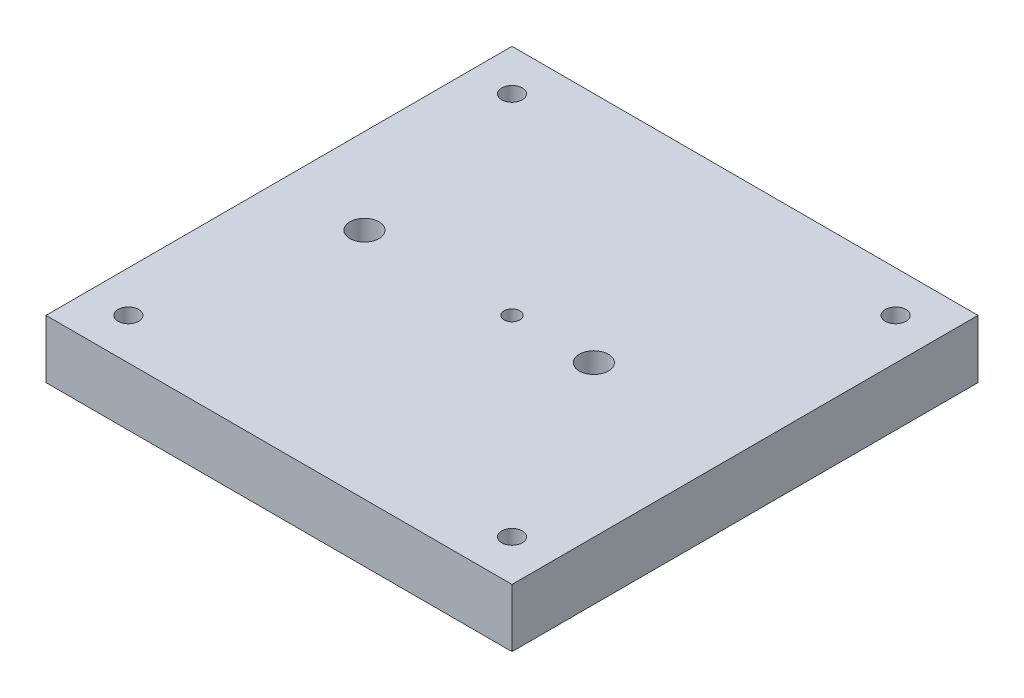
ISO-10303-21;
HEADER;
FILE_DESCRIPTION(('STEP AP214'),'2;1');
FILE_NAME('part.step','',(''),(''),'','','');
FILE_SCHEMA(('AUTOMOTIVE_DESIGN { 1 0 10303 214 1 1 1 1 }'));
ENDSEC;
DATA;
#1=APPLICATION_CONTEXT('core data for automotive mechanical design processes');
#2=APPLICATION_PROTOCOL_DEFINITION('international standard','automotive_design',2000,#1);
#3=PRODUCT_CONTEXT('',#1,'mechanical');
#4=PRODUCT('Part','Part','',(#3));
#5=PRODUCT_RELATED_PRODUCT_CATEGORY('part','',(#4));
#6=PRODUCT_DEFINITION_FORMATION('','',#4);
#7=PRODUCT_DEFINITION_CONTEXT('part definition',#1,'design');
#8=PRODUCT_DEFINITION('design','',#6,#7);
#9=PRODUCT_DEFINITION_SHAPE('','',#8);
#10=(LENGTH_UNIT() NAMED_UNIT(*) SI_UNIT(.MILLI.,.METRE.));
#11=(NAMED_UNIT(*) PLANE_ANGLE_UNIT() SI_UNIT($,.RADIAN.));
#12=(NAMED_UNIT(*) SI_UNIT($,.STERADIAN.) SOLID_ANGLE_UNIT());
#13=UNCERTAINTY_MEASURE_WITH_UNIT(LENGTH_MEASURE(1.E-05),#10,'distance_accuracy_value','');
#14=(GEOMETRIC_REPRESENTATION_CONTEXT(3) GLOBAL_UNCERTAINTY_ASSIGNED_CONTEXT((#13)) GLOBAL_UNIT_ASSIGNED_CONTEXT((#10,
#11,#12)) REPRESENTATION_CONTEXT('',''));
#15=CARTESIAN_POINT('',(0.,0.,0.));
#16=DIRECTION('',(0.,0.,1.));
#17=DIRECTION('',(1.,0.,0.));
#18=AXIS2_PLACEMENT_3D('',#15,#16,#17);
#19=CARTESIAN_POINT('',(50.8,-12.7,-50.8));
#20=DIRECTION('',(1.,0.,0.));
#21=DIRECTION('',(0.,0.,-1.));
#22=AXIS2_PLACEMENT_3D('',#19,#20,#21);
#23=PLANE('',#22);
#24=DIRECTION('',(0.,0.,-1.));
#25=VECTOR('',#24,1.);
#26=CARTESIAN_POINT('',(50.8,0.,-50.8));
#27=LINE('',#26,#25);
#28=CARTESIAN_POINT('',(50.8,0.,50.8));
#29=VERTEX_POINT('',#28);
#30=CARTESIAN_POINT('',(50.8,0.,-50.8));
#31=VERTEX_POINT('',#30);
#32=EDGE_CURVE('E119',#29,#31,#27,.T.);
#33=ORIENTED_EDGE('',*,*,#32,.F.);
#34=DIRECTION('',(0.,1.,0.));
#35=VECTOR('',#34,1.);
#36=CARTESIAN_POINT('',(50.8,-12.7,50.8));
#37=LINE('',#36,#35);
#38=CARTESIAN_POINT('',(50.8,-12.7,50.8));
#39=VERTEX_POINT('',#38);
#40=EDGE_CURVE('E12',#39,#29,#37,.T.);
#41=ORIENTED_EDGE('',*,*,#40,.F.);
#42=DIRECTION('',(0.,0.,-1.));
#43=VECTOR('',#42,1.);
#44=CARTESIAN_POINT('',(50.8,-12.7,-50.8));
#45=LINE('',#44,#43);
#46=CARTESIAN_POINT('',(50.8,-12.7,-50.8));
#47=VERTEX_POINT('',#46);
#48=EDGE_CURVE('E110',#39,#47,#45,.T.);
#49=ORIENTED_EDGE('',*,*,#48,.T.);
#50=DIRECTION('',(0.,1.,0.));
#51=VECTOR('',#50,1.);
#52=CARTESIAN_POINT('',(50.8,-12.7,-50.8));
#53=LINE('',#52,#51);
#54=EDGE_CURVE('E51',#47,#31,#53,.T.);
#55=ORIENTED_EDGE('',*,*,#54,.T.);
#56=EDGE_LOOP('',(#33,#41,#49,#55));
#57=FACE_BOUND('',#56,.T.);
#58=ADVANCED_FACE('F48',(#57),#23,.T.);
#59=CARTESIAN_POINT('',(-50.8,-12.7,50.8));
#60=DIRECTION('',(0.,0.,1.));
#61=DIRECTION('',(1.,0.,0.));
#62=AXIS2_PLACEMENT_3D('',#59,#60,#61);
#63=PLANE('',#62);
#64=DIRECTION('',(1.,0.,0.));
#65=VECTOR('',#64,1.);
#66=CARTESIAN_POINT('',(-50.8,0.,50.8));
#67=LINE('',#66,#65);
#68=CARTESIAN_POINT('',(-50.8,0.,50.8));
#69=VERTEX_POINT('',#68);
#70=EDGE_CURVE('E113',#69,#29,#67,.T.);
#71=ORIENTED_EDGE('',*,*,#70,.F.);
#72=DIRECTION('',(0.,1.,0.));
#73=VECTOR('',#72,1.);
#74=CARTESIAN_POINT('',(-50.8,-12.7,50.8));
#75=LINE('',#74,#73);
#76=CARTESIAN_POINT('',(-50.8,-12.7,50.8));
#77=VERTEX_POINT('',#76);
#78=EDGE_CURVE('E58',#77,#69,#75,.T.);
#79=ORIENTED_EDGE('',*,*,#78,.F.);
#80=DIRECTION('',(1.,0.,0.));
#81=VECTOR('',#80,1.);
#82=CARTESIAN_POINT('',(-50.8,-12.7,50.8));
#83=LINE('',#82,#81);
#84=EDGE_CURVE('E105',#77,#39,#83,.T.);
#85=ORIENTED_EDGE('',*,*,#84,.T.);
#86=ORIENTED_EDGE('',*,*,#40,.T.);
#87=EDGE_LOOP('',(#71,#79,#85,#86));
#88=FACE_BOUND('',#87,.T.);
#89=ADVANCED_FACE('F143',(#88),#63,.T.);
#90=CARTESIAN_POINT('',(-50.8,-12.7,-50.8));
#91=DIRECTION('',(-1.,0.,0.));
#92=DIRECTION('',(0.,0.,1.));
#93=AXIS2_PLACEMENT_3D('',#90,#91,#92);
#94=PLANE('',#93);
#95=DIRECTION('',(0.,0.,1.));
#96=VECTOR('',#95,1.);
#97=CARTESIAN_POINT('',(-50.8,0.,-50.8));
#98=LINE('',#97,#96);
#99=CARTESIAN_POINT('',(-50.8,0.,-50.8));
#100=VERTEX_POINT('',#99);
#101=EDGE_CURVE('E99',#100,#69,#98,.T.);
#102=ORIENTED_EDGE('',*,*,#101,.F.);
#103=DIRECTION('',(0.,1.,0.));
#104=VECTOR('',#103,1.);
#105=CARTESIAN_POINT('',(-50.8,-12.7,-50.8));
#106=LINE('',#105,#104);
#107=CARTESIAN_POINT('',(-50.8,-12.7,-50.8));
#108=VERTEX_POINT('',#107);
#109=EDGE_CURVE('E94',#108,#100,#106,.T.);
#110=ORIENTED_EDGE('',*,*,#109,.F.);
#111=DIRECTION('',(0.,0.,1.));
#112=VECTOR('',#111,1.);
#113=CARTESIAN_POINT('',(-50.8,-12.7,-50.8));
#114=LINE('',#113,#112);
#115=EDGE_CURVE('E97',#108,#77,#114,.T.);
#116=ORIENTED_EDGE('',*,*,#115,.T.);
#117=ORIENTED_EDGE('',*,*,#78,.T.);
#118=EDGE_LOOP('',(#102,#110,#116,#117));
#119=FACE_BOUND('',#118,.T.);
#120=ADVANCED_FACE('F96',(#119),#94,.T.);
#121=CARTESIAN_POINT('',(-50.8,-12.7,-50.8));
#122=DIRECTION('',(0.,0.,-1.));
#123=DIRECTION('',(-1.,0.,0.));
#124=AXIS2_PLACEMENT_3D('',#121,#122,#123);
#125=PLANE('',#124);
#126=DIRECTION('',(-1.,0.,0.));
#127=VECTOR('',#126,1.);
#128=CARTESIAN_POINT('',(-50.8,0.,-50.8));
#129=LINE('',#128,#127);
#130=EDGE_CURVE('E124',#31,#100,#129,.T.);
#131=ORIENTED_EDGE('',*,*,#130,.F.);
#132=ORIENTED_EDGE('',*,*,#54,.F.);
#133=DIRECTION('',(-1.,0.,0.));
#134=VECTOR('',#133,1.);
#135=CARTESIAN_POINT('',(-50.8,-12.7,-50.8));
#136=LINE('',#135,#134);
#137=EDGE_CURVE('E104',#47,#108,#136,.T.);
#138=ORIENTED_EDGE('',*,*,#137,.T.);
#139=ORIENTED_EDGE('',*,*,#109,.T.);
#140=EDGE_LOOP('',(#131,#132,#138,#139));
#141=FACE_BOUND('',#140,.T.);
#142=ADVANCED_FACE('F108',(#141),#125,.T.);
#143=CARTESIAN_POINT('',(0.,-12.7,0.));
#144=DIRECTION('',(0.,1.,0.));
#145=DIRECTION('',(0.,0.,1.));
#146=AXIS2_PLACEMENT_3D('',#143,#144,#145);
#147=PLANE('',#146);
#148=CARTESIAN_POINT('',(-41.8197438789284,-12.7,41.8197438789309));
#149=DIRECTION('',(0.,1.,0.));
#150=DIRECTION('',(0.,0.,1.));
#151=AXIS2_PLACEMENT_3D('',#148,#149,#150);
#152=CIRCLE('',#151,2.2479);
#153=CARTESIAN_POINT('',(-41.8197438789284,-12.7,44.0676438789309));
#154=VERTEX_POINT('',#153);
#155=EDGE_CURVE('E255',#154,#154,#152,.T.);
#156=ORIENTED_EDGE('',*,*,#155,.T.);
#157=EDGE_LOOP('',(#156));
#158=FACE_BOUND('',#157,.T.);
#159=CARTESIAN_POINT('',(41.8197438789333,-12.7,41.8197438789284));
#160=DIRECTION('',(0.,1.,0.));
#161=DIRECTION('',(0.,0.,1.));
#162=AXIS2_PLACEMENT_3D('',#159,#160,#161);
#163=CIRCLE('',#162,2.2479);
#164=CARTESIAN_POINT('',(41.8197438789333,-12.7,44.0676438789284));
#165=VERTEX_POINT('',#164);
#166=EDGE_CURVE('E247',#165,#165,#163,.T.);
#167=ORIENTED_EDGE('',*,*,#166,.T.);
#168=EDGE_LOOP('',(#167));
#169=FACE_BOUND('',#168,.T.);
#170=CARTESIAN_POINT('',(41.8197438789309,-12.7,-41.8197438789333));
#171=DIRECTION('',(0.,1.,0.));
#172=DIRECTION('',(0.,0.,1.));
#173=AXIS2_PLACEMENT_3D('',#170,#171,#172);
#174=CIRCLE('',#173,2.2479);
#175=CARTESIAN_POINT('',(41.8197438789309,-12.7,-39.5718438789333));
#176=VERTEX_POINT('',#175);
#177=EDGE_CURVE('E237',#176,#176,#174,.T.);
#178=ORIENTED_EDGE('',*,*,#177,.T.);
#179=EDGE_LOOP('',(#178));
#180=FACE_BOUND('',#179,.T.);
#181=CARTESIAN_POINT('',(0.,-12.7,0.));
#182=DIRECTION('',(0.,1.,0.));
#183=DIRECTION('',(0.,0.,1.));
#184=AXIS2_PLACEMENT_3D('',#181,#182,#183);
#185=CIRCLE('',#184,1.7272);
#186=CARTESIAN_POINT('',(0.,-12.7,1.72719999999999));
#187=VERTEX_POINT('',#186);
#188=EDGE_CURVE('E228',#187,#187,#185,.T.);
#189=ORIENTED_EDGE('',*,*,#188,.T.);
#190=EDGE_LOOP('',(#189));
#191=FACE_BOUND('',#190,.T.);
#192=CARTESIAN_POINT('',(-41.8197438789309,-12.7,-41.8197438789309));
#193=DIRECTION('',(0.,1.,0.));
#194=DIRECTION('',(0.,0.,1.));
#195=AXIS2_PLACEMENT_3D('',#192,#193,#194);
#196=CIRCLE('',#195,2.2479);
#197=CARTESIAN_POINT('',(-41.8197438789309,-12.7,-39.5718438789309));
#198=VERTEX_POINT('',#197);
#199=EDGE_CURVE('E220',#198,#198,#196,.T.);
#200=ORIENTED_EDGE('',*,*,#199,.T.);
#201=EDGE_LOOP('',(#200));
#202=FACE_BOUND('',#201,.T.);
#203=CARTESIAN_POINT('',(-32.16507791,-12.7,0.));
#204=DIRECTION('',(0.,1.,0.));
#205=DIRECTION('',(0.,0.,1.));
#206=AXIS2_PLACEMENT_3D('',#203,#204,#205);
#207=CIRCLE('',#206,3.175);
#208=CARTESIAN_POINT('',(-32.16507791,-12.7,3.17500000000001));
#209=VERTEX_POINT('',#208);
#210=EDGE_CURVE('E197',#209,#209,#207,.T.);
#211=ORIENTED_EDGE('',*,*,#210,.T.);
#212=EDGE_LOOP('',(#211));
#213=FACE_BOUND('',#212,.T.);
#214=CARTESIAN_POINT('',(17.8435508,-12.7,0.));
#215=DIRECTION('',(0.,1.,0.));
#216=DIRECTION('',(0.,0.,1.));
#217=AXIS2_PLACEMENT_3D('',#214,#215,#216);
#218=CIRCLE('',#217,3.175);
#219=CARTESIAN_POINT('',(17.8435508,-12.7,3.175));
#220=VERTEX_POINT('',#219);
#221=EDGE_CURVE('E125',#220,#220,#218,.T.);
#222=ORIENTED_EDGE('',*,*,#221,.T.);
#223=EDGE_LOOP('',(#222));
#224=FACE_BOUND('',#223,.T.);
#225=ORIENTED_EDGE('',*,*,#48,.F.);
#226=ORIENTED_EDGE('',*,*,#84,.F.);
#227=ORIENTED_EDGE('',*,*,#115,.F.);
#228=ORIENTED_EDGE('',*,*,#137,.F.);
#229=EDGE_LOOP('',(#225,#226,#227,#228));
#230=FACE_BOUND('',#229,.T.);
#231=ADVANCED_FACE('F103',(#158,#169,#180,#191,#202,#213,#224,#230),#147,.F.);
#232=CARTESIAN_POINT('',(0.,0.,0.));
#233=DIRECTION('',(0.,1.,0.));
#234=DIRECTION('',(0.,0.,1.));
#235=AXIS2_PLACEMENT_3D('',#232,#233,#234);
#236=PLANE('',#235);
#237=CARTESIAN_POINT('',(-41.8197438789284,0.,41.8197438789309));
#238=DIRECTION('',(0.,1.,0.));
#239=DIRECTION('',(0.,0.,1.));
#240=AXIS2_PLACEMENT_3D('',#237,#238,#239);
#241=CIRCLE('',#240,2.2479);
#242=CARTESIAN_POINT('',(-41.8197438789284,0.,44.0676438789309));
#243=VERTEX_POINT('',#242);
#244=EDGE_CURVE('E250',#243,#243,#241,.T.);
#245=ORIENTED_EDGE('',*,*,#244,.F.);
#246=EDGE_LOOP('',(#245));
#247=FACE_BOUND('',#246,.T.);
#248=CARTESIAN_POINT('',(41.8197438789333,0.,41.8197438789284));
#249=DIRECTION('',(0.,1.,0.));
#250=DIRECTION('',(0.,0.,1.));
#251=AXIS2_PLACEMENT_3D('',#248,#249,#250);
#252=CIRCLE('',#251,2.2479);
#253=CARTESIAN_POINT('',(41.8197438789333,0.,44.0676438789284));
#254=VERTEX_POINT('',#253);
#255=EDGE_CURVE('E242',#254,#254,#252,.T.);
#256=ORIENTED_EDGE('',*,*,#255,.F.);
#257=EDGE_LOOP('',(#256));
#258=FACE_BOUND('',#257,.T.);
#259=CARTESIAN_POINT('',(41.8197438789309,0.,-41.8197438789333));
#260=DIRECTION('',(0.,1.,0.));
#261=DIRECTION('',(0.,0.,1.));
#262=AXIS2_PLACEMENT_3D('',#259,#260,#261);
#263=CIRCLE('',#262,2.2479);
#264=CARTESIAN_POINT('',(41.8197438789309,0.,-39.5718438789333));
#265=VERTEX_POINT('',#264);
#266=EDGE_CURVE('E232',#265,#265,#263,.T.);
#267=ORIENTED_EDGE('',*,*,#266,.F.);
#268=EDGE_LOOP('',(#267));
#269=FACE_BOUND('',#268,.T.);
#270=CARTESIAN_POINT('',(0.,0.,0.));
#271=DIRECTION('',(0.,1.,0.));
#272=DIRECTION('',(0.,0.,1.));
#273=AXIS2_PLACEMENT_3D('',#270,#271,#272);
#274=CIRCLE('',#273,1.7272);
#275=CARTESIAN_POINT('',(0.,0.,1.72719999999999));
#276=VERTEX_POINT('',#275);
#277=EDGE_CURVE('E223',#276,#276,#274,.T.);
#278=ORIENTED_EDGE('',*,*,#277,.F.);
#279=EDGE_LOOP('',(#278));
#280=FACE_BOUND('',#279,.T.);
#281=CARTESIAN_POINT('',(-41.8197438789309,0.,-41.8197438789309));
#282=DIRECTION('',(0.,1.,0.));
#283=DIRECTION('',(0.,0.,1.));
#284=AXIS2_PLACEMENT_3D('',#281,#282,#283);
#285=CIRCLE('',#284,2.2479);
#286=CARTESIAN_POINT('',(-41.8197438789309,0.,-39.5718438789309));
#287=VERTEX_POINT('',#286);
#288=EDGE_CURVE('E208',#287,#287,#285,.T.);
#289=ORIENTED_EDGE('',*,*,#288,.F.);
#290=EDGE_LOOP('',(#289));
#291=FACE_BOUND('',#290,.T.);
#292=CARTESIAN_POINT('',(-32.16507791,0.,0.));
#293=DIRECTION('',(0.,1.,0.));
#294=DIRECTION('',(0.,0.,1.));
#295=AXIS2_PLACEMENT_3D('',#292,#293,#294);
#296=CIRCLE('',#295,3.175);
#297=CARTESIAN_POINT('',(-32.16507791,0.,3.17500000000001));
#298=VERTEX_POINT('',#297);
#299=EDGE_CURVE('E200',#298,#298,#296,.T.);
#300=ORIENTED_EDGE('',*,*,#299,.F.);
#301=EDGE_LOOP('',(#300));
#302=FACE_BOUND('',#301,.T.);
#303=CARTESIAN_POINT('',(17.8435508,0.,0.));
#304=DIRECTION('',(0.,1.,0.));
#305=DIRECTION('',(0.,0.,1.));
#306=AXIS2_PLACEMENT_3D('',#303,#304,#305);
#307=CIRCLE('',#306,3.175);
#308=CARTESIAN_POINT('',(17.8435508,0.,3.175));
#309=VERTEX_POINT('',#308);
#310=EDGE_CURVE('E203',#309,#309,#307,.T.);
#311=ORIENTED_EDGE('',*,*,#310,.F.);
#312=EDGE_LOOP('',(#311));
#313=FACE_BOUND('',#312,.T.);
#314=ORIENTED_EDGE('',*,*,#32,.T.);
#315=ORIENTED_EDGE('',*,*,#130,.T.);
#316=ORIENTED_EDGE('',*,*,#101,.T.);
#317=ORIENTED_EDGE('',*,*,#70,.T.);
#318=EDGE_LOOP('',(#314,#315,#316,#317));
#319=FACE_BOUND('',#318,.T.);
#320=ADVANCED_FACE('F142',(#247,#258,#269,#280,#291,#302,#313,#319),#236,.T.);
#321=CARTESIAN_POINT('',(17.8435508,-12.7,0.));
#322=DIRECTION('',(0.,1.,0.));
#323=DIRECTION('',(0.,0.,1.));
#324=AXIS2_PLACEMENT_3D('',#321,#322,#323);
#325=CYLINDRICAL_SURFACE('',#324,3.175);
#326=ORIENTED_EDGE('',*,*,#221,.F.);
#327=EDGE_LOOP('',(#326));
#328=FACE_BOUND('',#327,.T.);
#329=ORIENTED_EDGE('',*,*,#310,.T.);
#330=EDGE_LOOP('',(#329));
#331=FACE_BOUND('',#330,.T.);
#332=ADVANCED_FACE('F161',(#328,#331),#325,.F.);
#333=CARTESIAN_POINT('',(-32.16507791,-12.7,0.));
#334=DIRECTION('',(0.,1.,0.));
#335=DIRECTION('',(0.,0.,1.));
#336=AXIS2_PLACEMENT_3D('',#333,#334,#335);
#337=CYLINDRICAL_SURFACE('',#336,3.175);
#338=ORIENTED_EDGE('',*,*,#210,.F.);
#339=EDGE_LOOP('',(#338));
#340=FACE_BOUND('',#339,.T.);
#341=ORIENTED_EDGE('',*,*,#299,.T.);
#342=EDGE_LOOP('',(#341));
#343=FACE_BOUND('',#342,.T.);
#344=ADVANCED_FACE('F168',(#340,#343),#337,.F.);
#345=CARTESIAN_POINT('',(-41.8197438789309,-12.7,-41.8197438789309));
#346=DIRECTION('',(0.,1.,0.));
#347=DIRECTION('',(0.,0.,1.));
#348=AXIS2_PLACEMENT_3D('',#345,#346,#347);
#349=CYLINDRICAL_SURFACE('',#348,2.2479);
#350=ORIENTED_EDGE('',*,*,#199,.F.);
#351=EDGE_LOOP('',(#350));
#352=FACE_BOUND('',#351,.T.);
#353=ORIENTED_EDGE('',*,*,#288,.T.);
#354=EDGE_LOOP('',(#353));
#355=FACE_BOUND('',#354,.T.);
#356=ADVANCED_FACE('F185',(#352,#355),#349,.F.);
#357=CARTESIAN_POINT('',(0.,-12.7,0.));
#358=DIRECTION('',(0.,1.,0.));
#359=DIRECTION('',(0.,0.,1.));
#360=AXIS2_PLACEMENT_3D('',#357,#358,#359);
#361=CYLINDRICAL_SURFACE('',#360,1.7272);
#362=ORIENTED_EDGE('',*,*,#188,.F.);
#363=EDGE_LOOP('',(#362));
#364=FACE_BOUND('',#363,.T.);
#365=ORIENTED_EDGE('',*,*,#277,.T.);
#366=EDGE_LOOP('',(#365));
#367=FACE_BOUND('',#366,.T.);
#368=ADVANCED_FACE('F181',(#364,#367),#361,.F.);
#369=CARTESIAN_POINT('',(41.8197438789309,-12.7,-41.8197438789333));
#370=DIRECTION('',(0.,1.,0.));
#371=DIRECTION('',(0.,0.,1.));
#372=AXIS2_PLACEMENT_3D('',#369,#370,#371);
#373=CYLINDRICAL_SURFACE('',#372,2.2479);
#374=ORIENTED_EDGE('',*,*,#177,.F.);
#375=EDGE_LOOP('',(#374));
#376=FACE_BOUND('',#375,.T.);
#377=ORIENTED_EDGE('',*,*,#266,.T.);
#378=EDGE_LOOP('',(#377));
#379=FACE_BOUND('',#378,.T.);
#380=ADVANCED_FACE('F177',(#376,#379),#373,.F.);
#381=CARTESIAN_POINT('',(41.8197438789333,-12.7,41.8197438789284));
#382=DIRECTION('',(0.,1.,0.));
#383=DIRECTION('',(0.,0.,1.));
#384=AXIS2_PLACEMENT_3D('',#381,#382,#383);
#385=CYLINDRICAL_SURFACE('',#384,2.2479);
#386=ORIENTED_EDGE('',*,*,#166,.F.);
#387=EDGE_LOOP('',(#386));
#388=FACE_BOUND('',#387,.T.);
#389=ORIENTED_EDGE('',*,*,#255,.T.);
#390=EDGE_LOOP('',(#389));
#391=FACE_BOUND('',#390,.T.);
#392=ADVANCED_FACE('F173',(#388,#391),#385,.F.);
#393=CARTESIAN_POINT('',(-41.8197438789284,-12.7,41.8197438789309));
#394=DIRECTION('',(0.,1.,0.));
#395=DIRECTION('',(0.,0.,1.));
#396=AXIS2_PLACEMENT_3D('',#393,#394,#395);
#397=CYLINDRICAL_SURFACE('',#396,2.2479);
#398=ORIENTED_EDGE('',*,*,#155,.F.);
#399=EDGE_LOOP('',(#398));
#400=FACE_BOUND('',#399,.T.);
#401=ORIENTED_EDGE('',*,*,#244,.T.);
#402=EDGE_LOOP('',(#401));
#403=FACE_BOUND('',#402,.T.);
#404=ADVANCED_FACE('F170',(#400,#403),#397,.F.);
#405=CLOSED_SHELL('',(#58,#89,#120,#142,#231,#320,#332,#344,#356,#368,#380,#392,#404));
#406=MANIFOLD_SOLID_BREP('B2',#405);
#407=ADVANCED_BREP_SHAPE_REPRESENTATION('',(#18,#406),#14);
#408=SHAPE_DEFINITION_REPRESENTATION(#9,#407);
ENDSEC;
END-ISO-10303-21;
